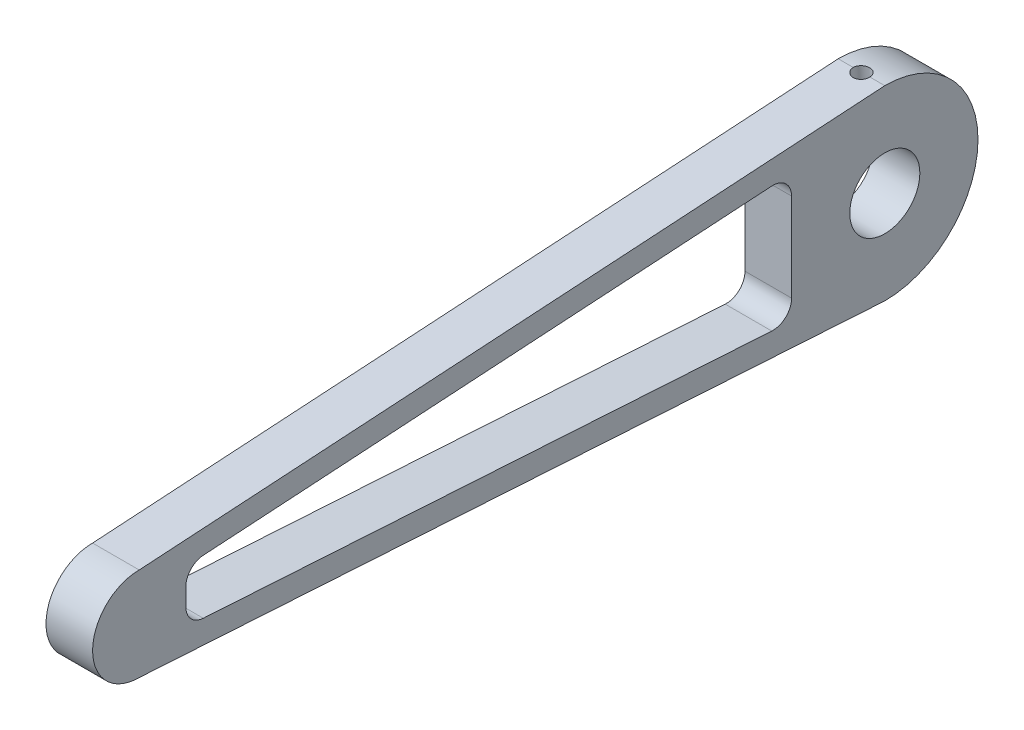
ISO-10303-21;
HEADER;
FILE_DESCRIPTION(('STEP AP214'),'2;1');
FILE_NAME('part.step','',(''),(''),'','','');
FILE_SCHEMA(('AUTOMOTIVE_DESIGN { 1 0 10303 214 1 1 1 1 }'));
ENDSEC;
DATA;
#1=APPLICATION_CONTEXT('core data for automotive mechanical design processes');
#2=APPLICATION_PROTOCOL_DEFINITION('international standard','automotive_design',2000,#1);
#3=PRODUCT_CONTEXT('',#1,'mechanical');
#4=PRODUCT('Part','Part','',(#3));
#5=PRODUCT_RELATED_PRODUCT_CATEGORY('part','',(#4));
#6=PRODUCT_DEFINITION_FORMATION('','',#4);
#7=PRODUCT_DEFINITION_CONTEXT('part definition',#1,'design');
#8=PRODUCT_DEFINITION('design','',#6,#7);
#9=PRODUCT_DEFINITION_SHAPE('','',#8);
#10=(LENGTH_UNIT() NAMED_UNIT(*) SI_UNIT(.MILLI.,.METRE.));
#11=(NAMED_UNIT(*) PLANE_ANGLE_UNIT() SI_UNIT($,.RADIAN.));
#12=(NAMED_UNIT(*) SI_UNIT($,.STERADIAN.) SOLID_ANGLE_UNIT());
#13=UNCERTAINTY_MEASURE_WITH_UNIT(LENGTH_MEASURE(1.E-05),#10,'distance_accuracy_value','');
#14=(GEOMETRIC_REPRESENTATION_CONTEXT(3) GLOBAL_UNCERTAINTY_ASSIGNED_CONTEXT((#13)) GLOBAL_UNIT_ASSIGNED_CONTEXT((#10,
#11,#12)) REPRESENTATION_CONTEXT('',''));
#15=CARTESIAN_POINT('',(0.,0.,0.));
#16=DIRECTION('',(0.,0.,1.));
#17=DIRECTION('',(1.,0.,0.));
#18=AXIS2_PLACEMENT_3D('',#15,#16,#17);
#19=CARTESIAN_POINT('',(6.35,12.6505836575875,0.790661478599224));
#20=DIRECTION('',(0.,-0.998052578482889,-0.0623782861551807));
#21=DIRECTION('',(0.,0.0623782861551807,-0.998052578482889));
#22=AXIS2_PLACEMENT_3D('',#19,#20,#21);
#23=PLANE('',#22);
#24=DIRECTION('',(-1.,0.,0.));
#25=VECTOR('',#24,1.);
#26=CARTESIAN_POINT('',(6.35,12.7,0.));
#27=LINE('',#26,#25);
#28=CARTESIAN_POINT('',(6.35,12.7,0.));
#29=VERTEX_POINT('',#28);
#30=CARTESIAN_POINT('',(4.30529999999999,12.7,0.));
#31=VERTEX_POINT('',#30);
#32=EDGE_CURVE('E202',#29,#31,#27,.T.);
#33=ORIENTED_EDGE('',*,*,#32,.T.);
#34=CARTESIAN_POINT('',(3.175,12.7,0.));
#35=DIRECTION('',(0.,0.998052578482889,0.0623782861551807));
#36=DIRECTION('',(0.,-0.0623782861551807,0.998052578482889));
#37=AXIS2_PLACEMENT_3D('',#34,#35,#36);
#38=CIRCLE('',#37,1.13029999999999);
#39=CARTESIAN_POINT('',(2.04470000000001,12.7,0.));
#40=VERTEX_POINT('',#39);
#41=EDGE_CURVE('E53',#40,#31,#38,.T.);
#42=ORIENTED_EDGE('',*,*,#41,.F.);
#43=CARTESIAN_POINT('',(0.,12.7,0.));
#44=VERTEX_POINT('',#43);
#45=EDGE_CURVE('E108',#40,#44,#27,.T.);
#46=ORIENTED_EDGE('',*,*,#45,.T.);
#47=DIRECTION('',(0.,-0.0623782861551807,0.998052578482889));
#48=VECTOR('',#47,1.);
#49=CARTESIAN_POINT('',(0.,12.6505836575875,0.790661478599224));
#50=LINE('',#49,#48);
#51=CARTESIAN_POINT('',(0.,6.34999999999998,101.6));
#52=VERTEX_POINT('',#51);
#53=EDGE_CURVE('E194',#44,#52,#50,.T.);
#54=ORIENTED_EDGE('',*,*,#53,.T.);
#55=DIRECTION('',(-1.,0.,0.));
#56=VECTOR('',#55,1.);
#57=CARTESIAN_POINT('',(6.35,6.34999999999998,101.6));
#58=LINE('',#57,#56);
#59=CARTESIAN_POINT('',(6.35,6.34999999999998,101.6));
#60=VERTEX_POINT('',#59);
#61=EDGE_CURVE('E11',#60,#52,#58,.T.);
#62=ORIENTED_EDGE('',*,*,#61,.F.);
#63=DIRECTION('',(0.,-0.0623782861551807,0.998052578482889));
#64=VECTOR('',#63,1.);
#65=CARTESIAN_POINT('',(6.35,12.6505836575875,0.790661478599224));
#66=LINE('',#65,#64);
#67=EDGE_CURVE('E148',#29,#60,#66,.T.);
#68=ORIENTED_EDGE('',*,*,#67,.F.);
#69=EDGE_LOOP('',(#33,#42,#46,#54,#62,#68));
#70=FACE_BOUND('',#69,.T.);
#71=ADVANCED_FACE('F37',(#70),#23,.F.);
#72=CARTESIAN_POINT('',(6.35,0.,101.6));
#73=DIRECTION('',(-1.,0.,0.));
#74=DIRECTION('',(0.,0.,1.));
#75=AXIS2_PLACEMENT_3D('',#72,#73,#74);
#76=CYLINDRICAL_SURFACE('',#75,6.35);
#77=CARTESIAN_POINT('',(0.,0.,101.6));
#78=DIRECTION('',(1.,0.,0.));
#79=DIRECTION('',(0.,0.,-1.));
#80=AXIS2_PLACEMENT_3D('',#77,#78,#79);
#81=CIRCLE('',#80,6.35);
#82=CARTESIAN_POINT('',(0.,-6.35000000000001,101.6));
#83=VERTEX_POINT('',#82);
#84=EDGE_CURVE('E154',#52,#83,#81,.T.);
#85=ORIENTED_EDGE('',*,*,#84,.T.);
#86=DIRECTION('',(-1.,0.,0.));
#87=VECTOR('',#86,1.);
#88=CARTESIAN_POINT('',(6.35,-6.35000000000001,101.6));
#89=LINE('',#88,#87);
#90=CARTESIAN_POINT('',(6.35,-6.35000000000001,101.6));
#91=VERTEX_POINT('',#90);
#92=EDGE_CURVE('E46',#91,#83,#89,.T.);
#93=ORIENTED_EDGE('',*,*,#92,.F.);
#94=CARTESIAN_POINT('',(6.35,0.,101.6));
#95=DIRECTION('',(1.,0.,0.));
#96=DIRECTION('',(0.,0.,-1.));
#97=AXIS2_PLACEMENT_3D('',#94,#95,#96);
#98=CIRCLE('',#97,6.35);
#99=EDGE_CURVE('E142',#60,#91,#98,.T.);
#100=ORIENTED_EDGE('',*,*,#99,.F.);
#101=ORIENTED_EDGE('',*,*,#61,.T.);
#102=EDGE_LOOP('',(#85,#93,#100,#101));
#103=FACE_BOUND('',#102,.T.);
#104=ADVANCED_FACE('F153',(#103),#76,.T.);
#105=CARTESIAN_POINT('',(6.35,-12.6505836575875,0.790661478599221));
#106=DIRECTION('',(0.,-0.998052578482889,0.0623782861551805));
#107=DIRECTION('',(0.,-0.0623782861551805,-0.998052578482889));
#108=AXIS2_PLACEMENT_3D('',#105,#106,#107);
#109=PLANE('',#108);
#110=DIRECTION('',(0.,0.0623782861551805,0.998052578482889));
#111=VECTOR('',#110,1.);
#112=CARTESIAN_POINT('',(0.,-12.6505836575875,0.790661478599221));
#113=LINE('',#112,#111);
#114=CARTESIAN_POINT('',(0.,-12.7,0.));
#115=VERTEX_POINT('',#114);
#116=EDGE_CURVE('E197',#115,#83,#113,.T.);
#117=ORIENTED_EDGE('',*,*,#116,.F.);
#118=DIRECTION('',(-1.,0.,0.));
#119=VECTOR('',#118,1.);
#120=CARTESIAN_POINT('',(6.35,-12.7,0.));
#121=LINE('',#120,#119);
#122=CARTESIAN_POINT('',(6.35,-12.7,0.));
#123=VERTEX_POINT('',#122);
#124=EDGE_CURVE('E158',#123,#115,#121,.T.);
#125=ORIENTED_EDGE('',*,*,#124,.F.);
#126=DIRECTION('',(0.,0.0623782861551805,0.998052578482889));
#127=VECTOR('',#126,1.);
#128=CARTESIAN_POINT('',(6.35,-12.6505836575875,0.790661478599221));
#129=LINE('',#128,#127);
#130=EDGE_CURVE('E146',#123,#91,#129,.T.);
#131=ORIENTED_EDGE('',*,*,#130,.T.);
#132=ORIENTED_EDGE('',*,*,#92,.T.);
#133=EDGE_LOOP('',(#117,#125,#131,#132));
#134=FACE_BOUND('',#133,.T.);
#135=ADVANCED_FACE('F160',(#134),#109,.T.);
#136=CARTESIAN_POINT('',(6.35,1.17947376988425,92.71));
#137=DIRECTION('',(-1.,0.,0.));
#138=DIRECTION('',(0.,0.,1.));
#139=AXIS2_PLACEMENT_3D('',#136,#137,#138);
#140=CYLINDRICAL_SURFACE('',#139,2.54);
#141=CARTESIAN_POINT('',(0.,1.17947376988425,92.71));
#142=DIRECTION('',(1.,0.,0.));
#143=DIRECTION('',(0.,0.,-1.));
#144=AXIS2_PLACEMENT_3D('',#141,#142,#143);
#145=CIRCLE('',#144,2.54);
#146=CARTESIAN_POINT('',(0.,3.71452731923079,92.8684408468341));
#147=VERTEX_POINT('',#146);
#148=CARTESIAN_POINT('',(0.,1.17947376988423,95.25));
#149=VERTEX_POINT('',#148);
#150=EDGE_CURVE('E169',#147,#149,#145,.T.);
#151=ORIENTED_EDGE('',*,*,#150,.F.);
#152=DIRECTION('',(-1.,0.,0.));
#153=VECTOR('',#152,1.);
#154=CARTESIAN_POINT('',(6.35,3.71452731923079,92.8684408468341));
#155=LINE('',#154,#153);
#156=CARTESIAN_POINT('',(6.35,3.71452731923079,92.8684408468341));
#157=VERTEX_POINT('',#156);
#158=EDGE_CURVE('E41',#157,#147,#155,.T.);
#159=ORIENTED_EDGE('',*,*,#158,.F.);
#160=CARTESIAN_POINT('',(6.35,1.17947376988425,92.71));
#161=DIRECTION('',(1.,0.,0.));
#162=DIRECTION('',(0.,0.,-1.));
#163=AXIS2_PLACEMENT_3D('',#160,#161,#162);
#164=CIRCLE('',#163,2.54);
#165=CARTESIAN_POINT('',(6.35,1.17947376988423,95.25));
#166=VERTEX_POINT('',#165);
#167=EDGE_CURVE('E257',#157,#166,#164,.T.);
#168=ORIENTED_EDGE('',*,*,#167,.T.);
#169=DIRECTION('',(-1.,0.,0.));
#170=VECTOR('',#169,1.);
#171=CARTESIAN_POINT('',(6.35,1.17947376988423,95.25));
#172=LINE('',#171,#170);
#173=EDGE_CURVE('E162',#166,#149,#172,.T.);
#174=ORIENTED_EDGE('',*,*,#173,.T.);
#175=EDGE_LOOP('',(#151,#159,#168,#174));
#176=FACE_BOUND('',#175,.T.);
#177=ADVANCED_FACE('F227',(#176),#140,.F.);
#178=CARTESIAN_POINT('',(6.35,9.48176672090438,0.592610420056523));
#179=DIRECTION('',(0.,-0.998052578482889,-0.0623782861551804));
#180=DIRECTION('',(0.,0.0623782861551804,-0.998052578482889));
#181=AXIS2_PLACEMENT_3D('',#178,#179,#180);
#182=PLANE('',#181);
#183=DIRECTION('',(0.,-0.0623782861551804,0.998052578482889));
#184=VECTOR('',#183,1.);
#185=CARTESIAN_POINT('',(0.,9.48176672090438,0.592610420056523));
#186=LINE('',#185,#184);
#187=CARTESIAN_POINT('',(0.,8.55640231923078,15.3984408468342));
#188=VERTEX_POINT('',#187);
#189=EDGE_CURVE('E173',#188,#147,#186,.T.);
#190=ORIENTED_EDGE('',*,*,#189,.F.);
#191=DIRECTION('',(-1.,0.,0.));
#192=VECTOR('',#191,1.);
#193=CARTESIAN_POINT('',(6.35,8.55640231923078,15.3984408468342));
#194=LINE('',#193,#192);
#195=CARTESIAN_POINT('',(6.35,8.55640231923078,15.3984408468342));
#196=VERTEX_POINT('',#195);
#197=EDGE_CURVE('E217',#196,#188,#194,.T.);
#198=ORIENTED_EDGE('',*,*,#197,.F.);
#199=DIRECTION('',(0.,-0.0623782861551804,0.998052578482889));
#200=VECTOR('',#199,1.);
#201=CARTESIAN_POINT('',(6.35,9.48176672090438,0.592610420056523));
#202=LINE('',#201,#200);
#203=EDGE_CURVE('E226',#196,#157,#202,.T.);
#204=ORIENTED_EDGE('',*,*,#203,.T.);
#205=ORIENTED_EDGE('',*,*,#158,.T.);
#206=EDGE_LOOP('',(#190,#198,#204,#205));
#207=FACE_BOUND('',#206,.T.);
#208=ADVANCED_FACE('F224',(#207),#182,.T.);
#209=CARTESIAN_POINT('',(6.35,6.02134876988424,15.24));
#210=DIRECTION('',(-1.,0.,0.));
#211=DIRECTION('',(0.,0.,1.));
#212=AXIS2_PLACEMENT_3D('',#209,#210,#211);
#213=CYLINDRICAL_SURFACE('',#212,2.54);
#214=CARTESIAN_POINT('',(0.,6.02134876988424,15.24));
#215=DIRECTION('',(1.,0.,0.));
#216=DIRECTION('',(0.,0.,-1.));
#217=AXIS2_PLACEMENT_3D('',#214,#215,#216);
#218=CIRCLE('',#217,2.54);
#219=CARTESIAN_POINT('',(0.,6.02134876988422,12.7));
#220=VERTEX_POINT('',#219);
#221=EDGE_CURVE('E176',#220,#188,#218,.T.);
#222=ORIENTED_EDGE('',*,*,#221,.F.);
#223=DIRECTION('',(-1.,0.,0.));
#224=VECTOR('',#223,1.);
#225=CARTESIAN_POINT('',(6.35,6.02134876988422,12.7));
#226=LINE('',#225,#224);
#227=CARTESIAN_POINT('',(6.35,6.02134876988422,12.7));
#228=VERTEX_POINT('',#227);
#229=EDGE_CURVE('E216',#228,#220,#226,.T.);
#230=ORIENTED_EDGE('',*,*,#229,.F.);
#231=CARTESIAN_POINT('',(6.35,6.02134876988424,15.24));
#232=DIRECTION('',(1.,0.,0.));
#233=DIRECTION('',(0.,0.,-1.));
#234=AXIS2_PLACEMENT_3D('',#231,#232,#233);
#235=CIRCLE('',#234,2.54);
#236=EDGE_CURVE('E236',#228,#196,#235,.T.);
#237=ORIENTED_EDGE('',*,*,#236,.T.);
#238=ORIENTED_EDGE('',*,*,#197,.T.);
#239=EDGE_LOOP('',(#222,#230,#237,#238));
#240=FACE_BOUND('',#239,.T.);
#241=ADVANCED_FACE('F234',(#240),#213,.F.);
#242=CARTESIAN_POINT('',(6.35,0.,12.7));
#243=DIRECTION('',(0.,0.,1.));
#244=DIRECTION('',(0.,-1.,0.));
#245=AXIS2_PLACEMENT_3D('',#242,#243,#244);
#246=PLANE('',#245);
#247=DIRECTION('',(0.,1.,0.));
#248=VECTOR('',#247,1.);
#249=CARTESIAN_POINT('',(0.,0.,12.7));
#250=LINE('',#249,#248);
#251=CARTESIAN_POINT('',(0.,-6.02134876988421,12.7));
#252=VERTEX_POINT('',#251);
#253=EDGE_CURVE('E179',#252,#220,#250,.T.);
#254=ORIENTED_EDGE('',*,*,#253,.F.);
#255=DIRECTION('',(-1.,0.,0.));
#256=VECTOR('',#255,1.);
#257=CARTESIAN_POINT('',(6.35,-6.02134876988421,12.7));
#258=LINE('',#257,#256);
#259=CARTESIAN_POINT('',(6.35,-6.02134876988421,12.7));
#260=VERTEX_POINT('',#259);
#261=EDGE_CURVE('E214',#260,#252,#258,.T.);
#262=ORIENTED_EDGE('',*,*,#261,.F.);
#263=DIRECTION('',(0.,1.,0.));
#264=VECTOR('',#263,1.);
#265=CARTESIAN_POINT('',(6.35,0.,12.7));
#266=LINE('',#265,#264);
#267=EDGE_CURVE('E241',#260,#228,#266,.T.);
#268=ORIENTED_EDGE('',*,*,#267,.T.);
#269=ORIENTED_EDGE('',*,*,#229,.T.);
#270=EDGE_LOOP('',(#254,#262,#268,#269));
#271=FACE_BOUND('',#270,.T.);
#272=ADVANCED_FACE('F243',(#271),#246,.T.);
#273=CARTESIAN_POINT('',(6.35,-6.02134876988423,15.24));
#274=DIRECTION('',(-1.,0.,0.));
#275=DIRECTION('',(0.,0.,1.));
#276=AXIS2_PLACEMENT_3D('',#273,#274,#275);
#277=CYLINDRICAL_SURFACE('',#276,2.54);
#278=CARTESIAN_POINT('',(0.,-6.02134876988423,15.24));
#279=DIRECTION('',(1.,0.,0.));
#280=DIRECTION('',(0.,0.,-1.));
#281=AXIS2_PLACEMENT_3D('',#278,#279,#280);
#282=CIRCLE('',#281,2.54);
#283=CARTESIAN_POINT('',(0.,-8.55640231923077,15.3984408468342));
#284=VERTEX_POINT('',#283);
#285=EDGE_CURVE('E182',#252,#284,#282,.F.);
#286=ORIENTED_EDGE('',*,*,#285,.T.);
#287=DIRECTION('',(-1.,0.,0.));
#288=VECTOR('',#287,1.);
#289=CARTESIAN_POINT('',(6.35,-8.55640231923077,15.3984408468342));
#290=LINE('',#289,#288);
#291=CARTESIAN_POINT('',(6.35,-8.55640231923077,15.3984408468342));
#292=VERTEX_POINT('',#291);
#293=EDGE_CURVE('E212',#292,#284,#290,.T.);
#294=ORIENTED_EDGE('',*,*,#293,.F.);
#295=CARTESIAN_POINT('',(6.35,-6.02134876988423,15.24));
#296=DIRECTION('',(1.,0.,0.));
#297=DIRECTION('',(0.,0.,-1.));
#298=AXIS2_PLACEMENT_3D('',#295,#296,#297);
#299=CIRCLE('',#298,2.54);
#300=EDGE_CURVE('E245',#260,#292,#299,.F.);
#301=ORIENTED_EDGE('',*,*,#300,.F.);
#302=ORIENTED_EDGE('',*,*,#261,.T.);
#303=EDGE_LOOP('',(#286,#294,#301,#302));
#304=FACE_BOUND('',#303,.T.);
#305=ADVANCED_FACE('F311',(#304),#277,.F.);
#306=CARTESIAN_POINT('',(6.35,-9.48176672090437,0.592610420056521));
#307=DIRECTION('',(0.,0.998052578482889,-0.0623782861551803));
#308=DIRECTION('',(0.,0.0623782861551803,0.998052578482889));
#309=AXIS2_PLACEMENT_3D('',#306,#307,#308);
#310=PLANE('',#309);
#311=DIRECTION('',(0.,-0.0623782861551803,-0.998052578482889));
#312=VECTOR('',#311,1.);
#313=CARTESIAN_POINT('',(0.,-9.48176672090437,0.592610420056521));
#314=LINE('',#313,#312);
#315=CARTESIAN_POINT('',(0.,-3.71452731923079,92.8684408468341));
#316=VERTEX_POINT('',#315);
#317=EDGE_CURVE('E185',#316,#284,#314,.T.);
#318=ORIENTED_EDGE('',*,*,#317,.F.);
#319=DIRECTION('',(-1.,0.,0.));
#320=VECTOR('',#319,1.);
#321=CARTESIAN_POINT('',(6.35,-3.71452731923079,92.8684408468341));
#322=LINE('',#321,#320);
#323=CARTESIAN_POINT('',(6.35,-3.71452731923079,92.8684408468341));
#324=VERTEX_POINT('',#323);
#325=EDGE_CURVE('E210',#324,#316,#322,.T.);
#326=ORIENTED_EDGE('',*,*,#325,.F.);
#327=DIRECTION('',(0.,-0.0623782861551803,-0.998052578482889));
#328=VECTOR('',#327,1.);
#329=CARTESIAN_POINT('',(6.35,-9.48176672090437,0.592610420056521));
#330=LINE('',#329,#328);
#331=EDGE_CURVE('E247',#324,#292,#330,.T.);
#332=ORIENTED_EDGE('',*,*,#331,.T.);
#333=ORIENTED_EDGE('',*,*,#293,.T.);
#334=EDGE_LOOP('',(#318,#326,#332,#333));
#335=FACE_BOUND('',#334,.T.);
#336=ADVANCED_FACE('F307',(#335),#310,.T.);
#337=CARTESIAN_POINT('',(6.35,-1.17947376988425,92.71));
#338=DIRECTION('',(-1.,0.,0.));
#339=DIRECTION('',(0.,0.,1.));
#340=AXIS2_PLACEMENT_3D('',#337,#338,#339);
#341=CYLINDRICAL_SURFACE('',#340,2.54);
#342=CARTESIAN_POINT('',(0.,-1.17947376988425,92.71));
#343=DIRECTION('',(1.,0.,0.));
#344=DIRECTION('',(0.,0.,-1.));
#345=AXIS2_PLACEMENT_3D('',#342,#343,#344);
#346=CIRCLE('',#345,2.54);
#347=CARTESIAN_POINT('',(0.,-1.17947376988423,95.25));
#348=VERTEX_POINT('',#347);
#349=EDGE_CURVE('E188',#316,#348,#346,.F.);
#350=ORIENTED_EDGE('',*,*,#349,.T.);
#351=DIRECTION('',(-1.,0.,0.));
#352=VECTOR('',#351,1.);
#353=CARTESIAN_POINT('',(6.35,-1.17947376988423,95.25));
#354=LINE('',#353,#352);
#355=CARTESIAN_POINT('',(6.35,-1.17947376988423,95.25));
#356=VERTEX_POINT('',#355);
#357=EDGE_CURVE('E207',#356,#348,#354,.T.);
#358=ORIENTED_EDGE('',*,*,#357,.F.);
#359=CARTESIAN_POINT('',(6.35,-1.17947376988425,92.71));
#360=DIRECTION('',(1.,0.,0.));
#361=DIRECTION('',(0.,0.,-1.));
#362=AXIS2_PLACEMENT_3D('',#359,#360,#361);
#363=CIRCLE('',#362,2.54);
#364=EDGE_CURVE('E253',#324,#356,#363,.F.);
#365=ORIENTED_EDGE('',*,*,#364,.F.);
#366=ORIENTED_EDGE('',*,*,#325,.T.);
#367=EDGE_LOOP('',(#350,#358,#365,#366));
#368=FACE_BOUND('',#367,.T.);
#369=ADVANCED_FACE('F304',(#368),#341,.F.);
#370=CARTESIAN_POINT('',(6.35,0.,95.25));
#371=DIRECTION('',(0.,0.,1.));
#372=DIRECTION('',(1.,0.,0.));
#373=AXIS2_PLACEMENT_3D('',#370,#371,#372);
#374=PLANE('',#373);
#375=DIRECTION('',(0.,1.,0.));
#376=VECTOR('',#375,1.);
#377=CARTESIAN_POINT('',(0.,0.,95.25));
#378=LINE('',#377,#376);
#379=EDGE_CURVE('E191',#348,#149,#378,.T.);
#380=ORIENTED_EDGE('',*,*,#379,.T.);
#381=ORIENTED_EDGE('',*,*,#173,.F.);
#382=DIRECTION('',(0.,1.,0.));
#383=VECTOR('',#382,1.);
#384=CARTESIAN_POINT('',(6.35,0.,95.25));
#385=LINE('',#384,#383);
#386=EDGE_CURVE('E256',#356,#166,#385,.T.);
#387=ORIENTED_EDGE('',*,*,#386,.F.);
#388=ORIENTED_EDGE('',*,*,#357,.T.);
#389=EDGE_LOOP('',(#380,#381,#387,#388));
#390=FACE_BOUND('',#389,.T.);
#391=ADVANCED_FACE('F262',(#390),#374,.F.);
#392=CARTESIAN_POINT('',(6.35,0.,0.));
#393=DIRECTION('',(-1.,0.,0.));
#394=DIRECTION('',(0.,0.,1.));
#395=AXIS2_PLACEMENT_3D('',#392,#393,#394);
#396=CYLINDRICAL_SURFACE('',#395,4.7752);
#397=CARTESIAN_POINT('',(3.175,4.73285013752802,0.634558599107276));
#398=CARTESIAN_POINT('',(3.11151882950589,4.73285114588403,0.634556798482284));
#399=CARTESIAN_POINT('',(3.0480148430869,4.73357397762376,0.629229702165897));
#400=CARTESIAN_POINT('',(2.92278735669801,4.73633943893156,0.608057678678909));
#401=CARTESIAN_POINT('',(2.8610649825369,4.73838288472024,0.592206246656541));
#402=CARTESIAN_POINT('',(2.74119508940079,4.74341756494876,0.550422474539075));
#403=CARTESIAN_POINT('',(2.68304634611021,4.74640847260516,0.524493609492883));
#404=CARTESIAN_POINT('',(2.57194658069813,4.75277502994429,0.463257850615519));
#405=CARTESIAN_POINT('',(2.51899508465638,4.75615064448604,0.42795181294864));
#406=CARTESIAN_POINT('',(2.41972915853178,4.76260343712634,0.348875636465337));
#407=CARTESIAN_POINT('',(2.37342146071143,4.76568031150076,0.305097016272129));
#408=CARTESIAN_POINT('',(2.28884011359141,4.77080188915886,0.210312918539787));
#409=CARTESIAN_POINT('',(2.25056595087372,4.77284665841546,0.159307903184076));
#410=CARTESIAN_POINT('',(2.18345570445841,4.77521515943121,0.0520117138525112));
#411=CARTESIAN_POINT('',(2.15453983149274,4.77555381994115,-0.00422920499828719));
#412=CARTESIAN_POINT('',(2.10649441222144,4.77402886325625,-0.120713739791049));
#413=CARTESIAN_POINT('',(2.08736378631216,4.77216548908643,-0.180956913336322));
#414=CARTESIAN_POINT('',(2.0595052325765,4.7659678486267,-0.302936792274511));
#415=CARTESIAN_POINT('',(2.0506593934756,4.76166244851645,-0.364648120295336));
#416=CARTESIAN_POINT('',(2.04305543167357,4.75055840822504,-0.488460625803771));
#417=CARTESIAN_POINT('',(2.04429785633816,4.74375963277824,-0.550561824262173));
#418=CARTESIAN_POINT('',(2.05671480160886,4.7277746234287,-0.674256385212459));
#419=CARTESIAN_POINT('',(2.06801615625239,4.71855896481351,-0.735833092491591));
#420=CARTESIAN_POINT('',(2.10022669011122,4.69823035969826,-0.856089952071215));
#421=CARTESIAN_POINT('',(2.12113799246346,4.68711699427676,-0.914769461116077));
#422=CARTESIAN_POINT('',(2.17296714502738,4.66314028207371,-1.03018163698914));
#423=CARTESIAN_POINT('',(2.20426290592601,4.65022358603243,-1.08673355696228));
#424=CARTESIAN_POINT('',(2.27573211653857,4.62389500747522,-1.19380683436372));
#425=CARTESIAN_POINT('',(2.31590823876436,4.61048297690441,-1.24432636930372));
#426=CARTESIAN_POINT('',(2.40556179974631,4.58376494247316,-1.3394591626265));
#427=CARTESIAN_POINT('',(2.45528498246616,4.57047457188823,-1.38384603398526));
#428=CARTESIAN_POINT('',(2.56200125812402,4.54561679152702,-1.46343660249351));
#429=CARTESIAN_POINT('',(2.61899312214497,4.5340490912136,-1.49864184892514));
#430=CARTESIAN_POINT('',(2.73684692201323,4.51413923836193,-1.55756966039975));
#431=CARTESIAN_POINT('',(2.79752745353712,4.50570597765464,-1.58162264059523));
#432=CARTESIAN_POINT('',(2.92252186776871,4.49249179901582,-1.61877998402092));
#433=CARTESIAN_POINT('',(2.98683323688338,4.48770838683611,-1.63189182482559));
#434=CARTESIAN_POINT('',(3.11186704114624,4.4825723131833,-1.64594358603376));
#435=CARTESIAN_POINT('',(3.17248019283562,4.48190433191411,-1.64774991039261));
#436=CARTESIAN_POINT('',(3.29310601765277,4.48422829252942,-1.64141502243848));
#437=CARTESIAN_POINT('',(3.35311878749594,4.4872196350417,-1.63327543919741));
#438=CARTESIAN_POINT('',(3.46878011625939,4.49638631510877,-1.60786090998528));
#439=CARTESIAN_POINT('',(3.52450752689846,4.50245163195485,-1.59090113285716));
#440=CARTESIAN_POINT('',(3.63236148130117,4.51714269729383,-1.54869411143864));
#441=CARTESIAN_POINT('',(3.68448731765213,4.52576894704663,-1.52344524459467));
#442=CARTESIAN_POINT('',(3.78643637305159,4.54533527216563,-1.4640637953699));
#443=CARTESIAN_POINT('',(3.83602479583198,4.55636737851958,-1.4295593020309));
#444=CARTESIAN_POINT('',(3.92900258715618,4.5795846850484,-1.35333847747123));
#445=CARTESIAN_POINT('',(3.97238966275275,4.59177030898216,-1.3116194912278));
#446=CARTESIAN_POINT('',(4.05510523435567,4.61735337598839,-1.2186359296045));
#447=CARTESIAN_POINT('',(4.09388790496991,4.63077331353193,-1.166890923053));
#448=CARTESIAN_POINT('',(4.16240072449617,4.65695856372647,-1.05755883712311));
#449=CARTESIAN_POINT('',(4.19212891617696,4.66972373434675,-0.999970498221719));
#450=CARTESIAN_POINT('',(4.24239334403246,4.69407801268154,-0.878688501649188));
#451=CARTESIAN_POINT('',(4.26264771332354,4.70562397622006,-0.814868730640538));
#452=CARTESIAN_POINT('',(4.291913033787,4.72637145699821,-0.68433182637367));
#453=CARTESIAN_POINT('',(4.30092638910889,4.73557347520935,-0.617615315809592));
#454=CARTESIAN_POINT('',(4.30708185531544,4.75091364227535,-0.48542904098476));
#455=CARTESIAN_POINT('',(4.30459105599912,4.75713963118614,-0.41998675243554));
#456=CARTESIAN_POINT('',(4.28842296408449,4.76681149763879,-0.290291402296482));
#457=CARTESIAN_POINT('',(4.27474845675912,4.77025806696336,-0.226038048679526));
#458=CARTESIAN_POINT('',(4.23726324085761,4.77446182710791,-0.103306980280018));
#459=CARTESIAN_POINT('',(4.21388299371038,4.77532175167392,-0.0447008730490386));
#460=CARTESIAN_POINT('',(4.15768654470713,4.77505034042436,0.0677890605360637));
#461=CARTESIAN_POINT('',(4.12487091651191,4.77391912564646,0.12167317372244));
#462=CARTESIAN_POINT('',(4.05105078285722,4.77026910603281,0.222726678025444));
#463=CARTESIAN_POINT('',(4.01011948756813,4.76776237580152,0.269950067592005));
#464=CARTESIAN_POINT('',(3.92102462706459,4.76203977164826,0.35695598033691));
#465=CARTESIAN_POINT('',(3.8728597260351,4.75882376669449,0.396737126117982));
#466=CARTESIAN_POINT('',(3.76996363977569,4.75232333623603,0.468260713816325));
#467=CARTESIAN_POINT('',(3.71515545834962,4.74903856412986,0.499892314586457));
#468=CARTESIAN_POINT('',(3.60102902477834,4.74308168013228,0.553575027045522));
#469=CARTESIAN_POINT('',(3.54171337364027,4.74040921843263,0.575631615342446));
#470=CARTESIAN_POINT('',(3.43126401665856,4.73654624595438,0.606513113666146));
#471=CARTESIAN_POINT('',(3.38059747411058,4.73517486726854,0.617012272475821));
#472=CARTESIAN_POINT('',(3.27829232070568,4.73332640443928,0.631035735083766));
#473=CARTESIAN_POINT('',(3.22665371338489,4.73284931704327,0.634560064249877));
#474=CARTESIAN_POINT('',(3.175,4.73285013752802,0.634558599107276));
#475=B_SPLINE_CURVE_WITH_KNOTS('',3,(#397,#398,#399,#400,#401,#402,#403,#404,#405,#406,#407,
#408,#409,#410,#411,#412,#413,#414,#415,#416,#417,#418,#419,#420,#421,#422,#423,#424,#425,#426,
#427,#428,#429,#430,#431,#432,#433,#434,#435,#436,#437,#438,#439,#440,#441,#442,#443,#444,#445,
#446,#447,#448,#449,#450,#451,#452,#453,#454,#455,#456,#457,#458,#459,#460,#461,#462,#463,#464,
#465,#466,#467,#468,#469,#470,#471,#472,#473,#474),.UNSPECIFIED.,.T.,.F.,(4,2,2,2,2,2,2,2,2,2,2,
2,2,2,2,2,2,2,2,2,2,2,2,2,2,2,2,2,2,2,2,2,2,2,2,2,2,2,4),(0.,0.190257765150382,
0.380633233892318,0.570943112723672,0.761235621655733,0.951719615230546,1.14219143138731,
1.33099365504145,1.51977504370179,1.70637009029048,1.89297526115988,2.08196722094377,
2.27100095502957,2.46784882579669,2.66475601805509,2.86765243649641,3.07051459657104,
3.26690670939335,3.46316449048192,3.64417680413153,3.8251594731709,4.00007923131869,
4.17503324969047,4.35848456995834,4.54200354681801,4.73924089039866,4.9365208389221,
5.13934615657647,5.34212808792622,5.53848490464703,5.73479283410715,5.92319367844052,
6.11158307063084,6.29834459349711,6.48514064773269,6.67435712243748,6.86346522817666,
7.01827579227406,7.17308579331586),.UNSPECIFIED.);
#476=CARTESIAN_POINT('',(3.175,4.73285013752802,0.634558599107276));
#477=VERTEX_POINT('',#476);
#478=EDGE_CURVE('E273',#477,#477,#475,.T.);
#479=ORIENTED_EDGE('',*,*,#478,.F.);
#480=EDGE_LOOP('',(#479));
#481=FACE_BOUND('',#480,.T.);
#482=CARTESIAN_POINT('',(6.35,0.,0.));
#483=DIRECTION('',(1.,0.,0.));
#484=DIRECTION('',(0.,0.,-1.));
#485=AXIS2_PLACEMENT_3D('',#482,#483,#484);
#486=CIRCLE('',#485,4.7752);
#487=CARTESIAN_POINT('',(6.35,0.,-4.7752));
#488=VERTEX_POINT('',#487);
#489=EDGE_CURVE('E201',#488,#488,#486,.T.);
#490=ORIENTED_EDGE('',*,*,#489,.T.);
#491=EDGE_LOOP('',(#490));
#492=FACE_BOUND('',#491,.T.);
#493=CARTESIAN_POINT('',(0.,0.,0.));
#494=DIRECTION('',(1.,0.,0.));
#495=DIRECTION('',(0.,0.,-1.));
#496=AXIS2_PLACEMENT_3D('',#493,#494,#495);
#497=CIRCLE('',#496,4.7752);
#498=CARTESIAN_POINT('',(0.,0.,-4.7752));
#499=VERTEX_POINT('',#498);
#500=EDGE_CURVE('E166',#499,#499,#497,.T.);
#501=ORIENTED_EDGE('',*,*,#500,.F.);
#502=EDGE_LOOP('',(#501));
#503=FACE_BOUND('',#502,.T.);
#504=ADVANCED_FACE('F39',(#481,#492,#503),#396,.F.);
#505=CARTESIAN_POINT('',(6.35,0.,0.));
#506=DIRECTION('',(-1.,0.,0.));
#507=DIRECTION('',(0.,0.,1.));
#508=AXIS2_PLACEMENT_3D('',#505,#506,#507);
#509=CYLINDRICAL_SURFACE('',#508,12.7);
#510=ORIENTED_EDGE('',*,*,#45,.F.);
#511=CARTESIAN_POINT('',(2.04470000000001,12.7,0.));
#512=CARTESIAN_POINT('',(2.04470016870411,12.7000006772475,-0.0319538982096098));
#513=CARTESIAN_POINT('',(2.04605057048585,12.699879251306,-0.0638921441537448));
#514=CARTESIAN_POINT('',(2.05143375137641,12.6993993750631,-0.127537374157741));
#515=CARTESIAN_POINT('',(2.05546631128025,12.6990409441314,-0.159244376902368));
#516=CARTESIAN_POINT('',(2.07154137017192,12.6976225664396,-0.253614578908575));
#517=CARTESIAN_POINT('',(2.0875613934986,12.6962194847793,-0.315641903844302));
#518=CARTESIAN_POINT('',(2.12973578836354,12.692653451043,-0.436110087039431));
#519=CARTESIAN_POINT('',(2.15589322913458,12.6904902688553,-0.494549852906177));
#520=CARTESIAN_POINT('',(2.21759510513422,12.6856462121805,-0.606221382860483));
#521=CARTESIAN_POINT('',(2.25313859573075,12.682965389797,-0.659453670301342));
#522=CARTESIAN_POINT('',(2.33277092783892,12.6773750910227,-0.75939472559653));
#523=CARTESIAN_POINT('',(2.37689052469382,12.6744648147927,-0.806078941431606));
#524=CARTESIAN_POINT('',(2.47237302503489,12.6687531667134,-0.891360996608744));
#525=CARTESIAN_POINT('',(2.52373681025094,12.6659518081742,-0.929957850170023));
#526=CARTESIAN_POINT('',(2.63214388569399,12.6607847097814,-0.997843315650743));
#527=CARTESIAN_POINT('',(2.68917390763559,12.6584179875619,-1.02715303001778));
#528=CARTESIAN_POINT('',(2.80739207186448,12.6543856867415,-1.07569507512641));
#529=CARTESIAN_POINT('',(2.86857971113281,12.6527200234962,-1.09492862251259));
#530=CARTESIAN_POINT('',(2.99274738410414,12.6502958608988,-1.1225896152144));
#531=CARTESIAN_POINT('',(3.05570441785465,12.6495287609366,-1.13111956729051));
#532=CARTESIAN_POINT('',(3.18215976755347,12.6489613929619,-1.1374473684526));
#533=CARTESIAN_POINT('',(3.2456580681433,12.6491610976067,-1.13524552104865));
#534=CARTESIAN_POINT('',(3.37091757806186,12.650499286872,-1.12023324334426));
#535=CARTESIAN_POINT('',(3.4326879140962,12.6516311025009,-1.10749817250897));
#536=CARTESIAN_POINT('',(3.55321757092429,12.6546960959953,-1.07190627093242));
#537=CARTESIAN_POINT('',(3.61197685070066,12.6566292847742,-1.04904930234894));
#538=CARTESIAN_POINT('',(3.72505787036051,12.6610875067226,-0.993795882205186));
#539=CARTESIAN_POINT('',(3.779363037529,12.6636146259741,-0.961365701104592));
#540=CARTESIAN_POINT('',(3.88181574418547,12.6689743785643,-0.887940745245122));
#541=CARTESIAN_POINT('',(3.92996321631582,12.6718070152443,-0.846945876811966));
#542=CARTESIAN_POINT('',(4.01924518830488,12.6774933158541,-0.757103011494307));
#543=CARTESIAN_POINT('',(4.06030521596195,12.6803469088931,-0.708180999554838));
#544=CARTESIAN_POINT('',(4.13370405266018,12.6857292161915,-0.60413832624332));
#545=CARTESIAN_POINT('',(4.16603979978294,12.6882578162271,-0.549015498193404));
#546=CARTESIAN_POINT('',(4.22124563113461,12.6927219752194,-0.433768791093391));
#547=CARTESIAN_POINT('',(4.24405371071667,12.6946536288156,-0.373615119706076));
#548=CARTESIAN_POINT('',(4.27921109090368,12.6976809878878,-0.250358249935127));
#549=CARTESIAN_POINT('',(4.2915764979093,12.6987779804549,-0.187259752771897));
#550=CARTESIAN_POINT('',(4.30079841447587,12.6995983368662,-0.103102773205938));
#551=CARTESIAN_POINT('',(4.30248708963648,12.699748869884,-0.0825007264808148));
#552=CARTESIAN_POINT('',(4.30473637344229,12.6999495761865,-0.0412686413857564));
#553=CARTESIAN_POINT('',(4.30529883394408,12.6999999142231,-0.0206387048763067));
#554=CARTESIAN_POINT('',(4.30529999999999,12.7,0.));
#555=B_SPLINE_CURVE_WITH_KNOTS('',3,(#511,#512,#513,#514,#515,#516,#517,#518,#519,#520,#521,
#522,#523,#524,#525,#526,#527,#528,#529,#530,#531,#532,#533,#534,#535,#536,#537,#538,#539,#540,
#541,#542,#543,#544,#545,#546,#547,#548,#549,#550,#551,#552,#553,#554),.UNSPECIFIED.,.F.,.F.,(4,
2,2,2,2,2,2,2,2,2,2,2,2,2,2,2,2,2,2,2,2,4),(0.,0.0958020568136573,0.191596284965961,
0.382844355937046,0.574150374999017,0.765437147948268,0.957423002761199,1.14943224542371,
1.34100201863915,1.5325486554697,1.72224651937299,1.91193901839072,2.10028599267238,
2.28863553198309,2.47765677398845,2.66668008347799,2.85758242965833,3.04855168901015,
3.24074508321924,3.43264150106633,3.49463441648128,3.55652531175686),.UNSPECIFIED.);
#556=EDGE_CURVE('E170',#40,#31,#555,.T.);
#557=ORIENTED_EDGE('',*,*,#556,.T.);
#558=ORIENTED_EDGE('',*,*,#32,.F.);
#559=CARTESIAN_POINT('',(6.35,0.,0.));
#560=DIRECTION('',(1.,0.,0.));
#561=DIRECTION('',(0.,0.,-1.));
#562=AXIS2_PLACEMENT_3D('',#559,#560,#561);
#563=CIRCLE('',#562,12.7);
#564=EDGE_CURVE('E62',#123,#29,#563,.T.);
#565=ORIENTED_EDGE('',*,*,#564,.F.);
#566=ORIENTED_EDGE('',*,*,#124,.T.);
#567=CARTESIAN_POINT('',(0.,0.,0.));
#568=DIRECTION('',(1.,0.,0.));
#569=DIRECTION('',(0.,0.,-1.));
#570=AXIS2_PLACEMENT_3D('',#567,#568,#569);
#571=CIRCLE('',#570,12.7);
#572=EDGE_CURVE('E199',#115,#44,#571,.T.);
#573=ORIENTED_EDGE('',*,*,#572,.T.);
#574=EDGE_LOOP('',(#510,#557,#558,#565,#566,#573));
#575=FACE_BOUND('',#574,.T.);
#576=ADVANCED_FACE('F278',(#575),#509,.T.);
#577=CARTESIAN_POINT('',(6.35,0.,0.));
#578=DIRECTION('',(1.,0.,0.));
#579=DIRECTION('',(0.,0.,-1.));
#580=AXIS2_PLACEMENT_3D('',#577,#578,#579);
#581=PLANE('',#580);
#582=ORIENTED_EDGE('',*,*,#489,.F.);
#583=EDGE_LOOP('',(#582));
#584=FACE_BOUND('',#583,.T.);
#585=ORIENTED_EDGE('',*,*,#167,.F.);
#586=ORIENTED_EDGE('',*,*,#203,.F.);
#587=ORIENTED_EDGE('',*,*,#236,.F.);
#588=ORIENTED_EDGE('',*,*,#267,.F.);
#589=ORIENTED_EDGE('',*,*,#300,.T.);
#590=ORIENTED_EDGE('',*,*,#331,.F.);
#591=ORIENTED_EDGE('',*,*,#364,.T.);
#592=ORIENTED_EDGE('',*,*,#386,.T.);
#593=EDGE_LOOP('',(#585,#586,#587,#588,#589,#590,#591,#592));
#594=FACE_BOUND('',#593,.T.);
#595=ORIENTED_EDGE('',*,*,#67,.T.);
#596=ORIENTED_EDGE('',*,*,#99,.T.);
#597=ORIENTED_EDGE('',*,*,#130,.F.);
#598=ORIENTED_EDGE('',*,*,#564,.T.);
#599=EDGE_LOOP('',(#595,#596,#597,#598));
#600=FACE_BOUND('',#599,.T.);
#601=ADVANCED_FACE('F144',(#584,#594,#600),#581,.T.);
#602=CARTESIAN_POINT('',(0.,0.,0.));
#603=DIRECTION('',(1.,0.,0.));
#604=DIRECTION('',(0.,0.,-1.));
#605=AXIS2_PLACEMENT_3D('',#602,#603,#604);
#606=PLANE('',#605);
#607=ORIENTED_EDGE('',*,*,#500,.T.);
#608=EDGE_LOOP('',(#607));
#609=FACE_BOUND('',#608,.T.);
#610=ORIENTED_EDGE('',*,*,#150,.T.);
#611=ORIENTED_EDGE('',*,*,#379,.F.);
#612=ORIENTED_EDGE('',*,*,#349,.F.);
#613=ORIENTED_EDGE('',*,*,#317,.T.);
#614=ORIENTED_EDGE('',*,*,#285,.F.);
#615=ORIENTED_EDGE('',*,*,#253,.T.);
#616=ORIENTED_EDGE('',*,*,#221,.T.);
#617=ORIENTED_EDGE('',*,*,#189,.T.);
#618=EDGE_LOOP('',(#610,#611,#612,#613,#614,#615,#616,#617));
#619=FACE_BOUND('',#618,.T.);
#620=ORIENTED_EDGE('',*,*,#53,.F.);
#621=ORIENTED_EDGE('',*,*,#572,.F.);
#622=ORIENTED_EDGE('',*,*,#116,.T.);
#623=ORIENTED_EDGE('',*,*,#84,.F.);
#624=EDGE_LOOP('',(#620,#621,#622,#623));
#625=FACE_BOUND('',#624,.T.);
#626=ADVANCED_FACE('F230',(#609,#619,#625),#606,.F.);
#627=CARTESIAN_POINT('',(3.175,12.7,0.));
#628=DIRECTION('',(0.,0.998052578482889,0.0623782861551807));
#629=DIRECTION('',(0.,-0.0623782861551807,0.998052578482889));
#630=AXIS2_PLACEMENT_3D('',#627,#628,#629);
#631=CYLINDRICAL_SURFACE('',#630,1.13029999999999);
#632=ORIENTED_EDGE('',*,*,#478,.T.);
#633=EDGE_LOOP('',(#632));
#634=FACE_BOUND('',#633,.T.);
#635=ORIENTED_EDGE('',*,*,#41,.T.);
#636=ORIENTED_EDGE('',*,*,#556,.F.);
#637=EDGE_LOOP('',(#635,#636));
#638=FACE_BOUND('',#637,.T.);
#639=ADVANCED_FACE('F282',(#634,#638),#631,.F.);
#640=CLOSED_SHELL('',(#71,#104,#135,#177,#208,#241,#272,#305,#336,#369,#391,#504,#576,#601,#626,#639));
#641=MANIFOLD_SOLID_BREP('B2',#640);
#642=ADVANCED_BREP_SHAPE_REPRESENTATION('',(#18,#641),#14);
#643=SHAPE_DEFINITION_REPRESENTATION(#9,#642);
ENDSEC;
END-ISO-10303-21;
